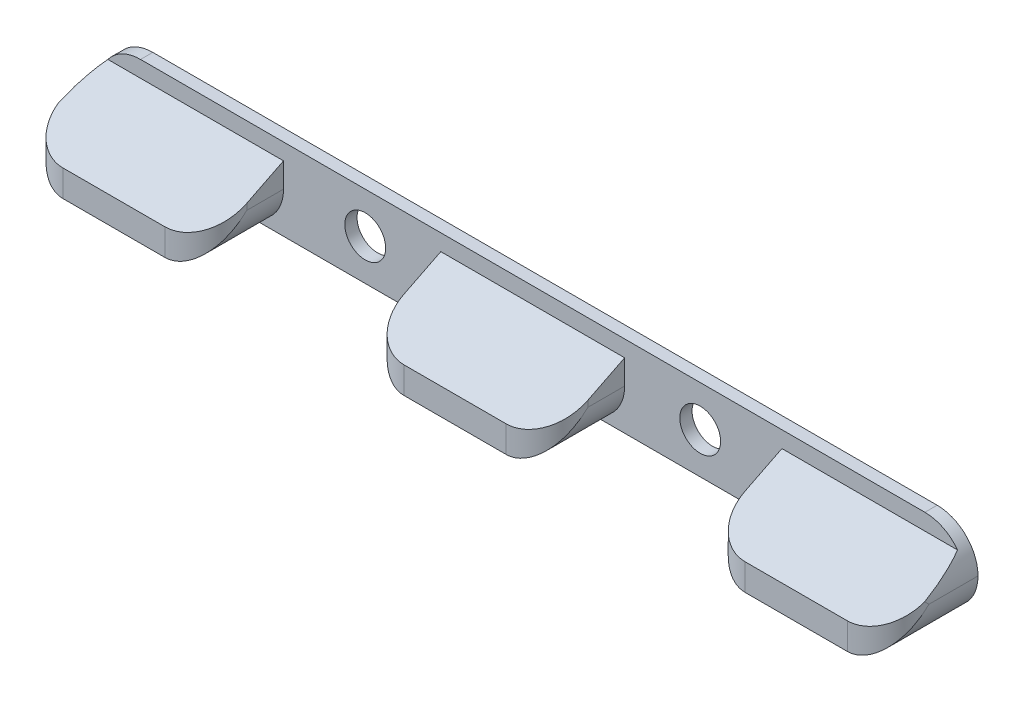
ISO-10303-21;
HEADER;
FILE_DESCRIPTION(('STEP AP214'),'2;1');
FILE_NAME('part.step','',(''),(''),'','','');
FILE_SCHEMA(('AUTOMOTIVE_DESIGN { 1 0 10303 214 1 1 1 1 }'));
ENDSEC;
DATA;
#1=APPLICATION_CONTEXT('core data for automotive mechanical design processes');
#2=APPLICATION_PROTOCOL_DEFINITION('international standard','automotive_design',2000,#1);
#3=PRODUCT_CONTEXT('',#1,'mechanical');
#4=PRODUCT('Part','Part','',(#3));
#5=PRODUCT_RELATED_PRODUCT_CATEGORY('part','',(#4));
#6=PRODUCT_DEFINITION_FORMATION('','',#4);
#7=PRODUCT_DEFINITION_CONTEXT('part definition',#1,'design');
#8=PRODUCT_DEFINITION('design','',#6,#7);
#9=PRODUCT_DEFINITION_SHAPE('','',#8);
#10=(LENGTH_UNIT() NAMED_UNIT(*) SI_UNIT(.MILLI.,.METRE.));
#11=(NAMED_UNIT(*) PLANE_ANGLE_UNIT() SI_UNIT($,.RADIAN.));
#12=(NAMED_UNIT(*) SI_UNIT($,.STERADIAN.) SOLID_ANGLE_UNIT());
#13=UNCERTAINTY_MEASURE_WITH_UNIT(LENGTH_MEASURE(1.E-05),#10,'distance_accuracy_value','');
#14=(GEOMETRIC_REPRESENTATION_CONTEXT(3) GLOBAL_UNCERTAINTY_ASSIGNED_CONTEXT((#13)) GLOBAL_UNIT_ASSIGNED_CONTEXT((#10,
#11,#12)) REPRESENTATION_CONTEXT('',''));
#15=CARTESIAN_POINT('',(0.,0.,0.));
#16=DIRECTION('',(0.,0.,1.));
#17=DIRECTION('',(1.,0.,0.));
#18=AXIS2_PLACEMENT_3D('',#15,#16,#17);
#19=CARTESIAN_POINT('',(96.,0.,3.));
#20=DIRECTION('',(0.,0.,-1.));
#21=DIRECTION('',(-1.,0.,0.));
#22=AXIS2_PLACEMENT_3D('',#19,#20,#21);
#23=PLANE('',#22);
#24=CARTESIAN_POINT('',(-96.,0.,3.));
#25=DIRECTION('',(0.,0.,1.));
#26=DIRECTION('',(-1.,0.,0.));
#27=AXIS2_PLACEMENT_3D('',#24,#25,#26);
#28=CIRCLE('',#27,10.);
#29=CARTESIAN_POINT('',(-96.,10.,3.));
#30=VERTEX_POINT('',#29);
#31=CARTESIAN_POINT('',(-104.,6.00000000000014,3.));
#32=VERTEX_POINT('',#31);
#33=EDGE_CURVE('E378',#30,#32,#28,.T.);
#34=ORIENTED_EDGE('',*,*,#33,.T.);
#35=DIRECTION('',(1.,0.,0.));
#36=VECTOR('',#35,1.);
#37=CARTESIAN_POINT('',(96.,6.00000000000014,3.));
#38=LINE('',#37,#36);
#39=CARTESIAN_POINT('',(-61.,6.00000000000014,3.));
#40=VERTEX_POINT('',#39);
#41=EDGE_CURVE('E420',#32,#40,#38,.T.);
#42=ORIENTED_EDGE('',*,*,#41,.T.);
#43=DIRECTION('',(0.,-1.,0.));
#44=VECTOR('',#43,1.);
#45=CARTESIAN_POINT('',(-61.,0.,3.));
#46=LINE('',#45,#44);
#47=CARTESIAN_POINT('',(-61.,0.,3.));
#48=VERTEX_POINT('',#47);
#49=EDGE_CURVE('E343',#40,#48,#46,.T.);
#50=ORIENTED_EDGE('',*,*,#49,.T.);
#51=CARTESIAN_POINT('',(-71.,0.,3.));
#52=DIRECTION('',(0.,0.,-1.));
#53=DIRECTION('',(-1.,0.,0.));
#54=AXIS2_PLACEMENT_3D('',#51,#52,#53);
#55=CIRCLE('',#54,10.);
#56=CARTESIAN_POINT('',(-71.,-10.,3.));
#57=VERTEX_POINT('',#56);
#58=EDGE_CURVE('E291',#48,#57,#55,.T.);
#59=ORIENTED_EDGE('',*,*,#58,.T.);
#60=DIRECTION('',(1.,0.,0.));
#61=VECTOR('',#60,1.);
#62=CARTESIAN_POINT('',(-106.,-10.,3.));
#63=LINE('',#62,#61);
#64=CARTESIAN_POINT('',(-12.5,-10.,3.));
#65=VERTEX_POINT('',#64);
#66=EDGE_CURVE('E305',#57,#65,#63,.T.);
#67=ORIENTED_EDGE('',*,*,#66,.T.);
#68=CARTESIAN_POINT('',(-12.5,0.,3.));
#69=DIRECTION('',(0.,0.,-1.));
#70=DIRECTION('',(-1.,0.,0.));
#71=AXIS2_PLACEMENT_3D('',#68,#69,#70);
#72=CIRCLE('',#71,10.);
#73=CARTESIAN_POINT('',(-22.5,0.,3.));
#74=VERTEX_POINT('',#73);
#75=EDGE_CURVE('E54',#65,#74,#72,.T.);
#76=ORIENTED_EDGE('',*,*,#75,.T.);
#77=DIRECTION('',(0.,1.,0.));
#78=VECTOR('',#77,1.);
#79=CARTESIAN_POINT('',(-22.5,0.,3.));
#80=LINE('',#79,#78);
#81=CARTESIAN_POINT('',(-22.5,6.00000000000014,3.));
#82=VERTEX_POINT('',#81);
#83=EDGE_CURVE('E303',#74,#82,#80,.T.);
#84=ORIENTED_EDGE('',*,*,#83,.T.);
#85=DIRECTION('',(1.,0.,0.));
#86=VECTOR('',#85,1.);
#87=CARTESIAN_POINT('',(96.,6.00000000000014,3.));
#88=LINE('',#87,#86);
#89=CARTESIAN_POINT('',(22.5,6.00000000000014,3.));
#90=VERTEX_POINT('',#89);
#91=EDGE_CURVE('E413',#82,#90,#88,.T.);
#92=ORIENTED_EDGE('',*,*,#91,.T.);
#93=DIRECTION('',(0.,-1.,0.));
#94=VECTOR('',#93,1.);
#95=CARTESIAN_POINT('',(22.5,0.,3.));
#96=LINE('',#95,#94);
#97=CARTESIAN_POINT('',(22.5,0.,3.));
#98=VERTEX_POINT('',#97);
#99=EDGE_CURVE('E234',#90,#98,#96,.T.);
#100=ORIENTED_EDGE('',*,*,#99,.T.);
#101=CARTESIAN_POINT('',(12.5,0.,3.));
#102=DIRECTION('',(0.,0.,-1.));
#103=DIRECTION('',(-1.,0.,0.));
#104=AXIS2_PLACEMENT_3D('',#101,#102,#103);
#105=CIRCLE('',#104,10.);
#106=CARTESIAN_POINT('',(12.5,-10.,3.));
#107=VERTEX_POINT('',#106);
#108=EDGE_CURVE('E11',#98,#107,#105,.T.);
#109=ORIENTED_EDGE('',*,*,#108,.T.);
#110=CARTESIAN_POINT('',(71.,-10.,3.));
#111=VERTEX_POINT('',#110);
#112=EDGE_CURVE('E381',#107,#111,#63,.T.);
#113=ORIENTED_EDGE('',*,*,#112,.T.);
#114=CARTESIAN_POINT('',(71.,0.,3.));
#115=DIRECTION('',(0.,0.,-1.));
#116=DIRECTION('',(-1.,0.,0.));
#117=AXIS2_PLACEMENT_3D('',#114,#115,#116);
#118=CIRCLE('',#117,10.);
#119=CARTESIAN_POINT('',(61.,0.,3.));
#120=VERTEX_POINT('',#119);
#121=EDGE_CURVE('E295',#111,#120,#118,.T.);
#122=ORIENTED_EDGE('',*,*,#121,.T.);
#123=DIRECTION('',(0.,1.,0.));
#124=VECTOR('',#123,1.);
#125=CARTESIAN_POINT('',(61.,0.,3.));
#126=LINE('',#125,#124);
#127=CARTESIAN_POINT('',(61.,6.00000000000014,3.));
#128=VERTEX_POINT('',#127);
#129=EDGE_CURVE('E332',#120,#128,#126,.T.);
#130=ORIENTED_EDGE('',*,*,#129,.T.);
#131=DIRECTION('',(1.,0.,0.));
#132=VECTOR('',#131,1.);
#133=CARTESIAN_POINT('',(106.,6.00000000000014,3.));
#134=LINE('',#133,#132);
#135=CARTESIAN_POINT('',(104.,6.00000000000014,3.));
#136=VERTEX_POINT('',#135);
#137=EDGE_CURVE('E416',#128,#136,#134,.T.);
#138=ORIENTED_EDGE('',*,*,#137,.T.);
#139=CARTESIAN_POINT('',(96.,0.,3.));
#140=DIRECTION('',(0.,0.,1.));
#141=DIRECTION('',(-1.,0.,0.));
#142=AXIS2_PLACEMENT_3D('',#139,#140,#141);
#143=CIRCLE('',#142,10.);
#144=CARTESIAN_POINT('',(96.,10.,3.));
#145=VERTEX_POINT('',#144);
#146=EDGE_CURVE('E371',#136,#145,#143,.T.);
#147=ORIENTED_EDGE('',*,*,#146,.T.);
#148=DIRECTION('',(-1.,0.,0.));
#149=VECTOR('',#148,1.);
#150=CARTESIAN_POINT('',(-96.,10.,3.));
#151=LINE('',#150,#149);
#152=EDGE_CURVE('E374',#145,#30,#151,.T.);
#153=ORIENTED_EDGE('',*,*,#152,.T.);
#154=EDGE_LOOP('',(#34,#42,#50,#59,#67,#76,#84,#92,#100,#109,#113,#122,#130,#138,#147,#153));
#155=FACE_BOUND('',#154,.T.);
#156=CARTESIAN_POINT('',(-41.,0.,3.));
#157=DIRECTION('',(0.,0.,1.));
#158=DIRECTION('',(1.,0.,0.));
#159=AXIS2_PLACEMENT_3D('',#156,#157,#158);
#160=CIRCLE('',#159,5.);
#161=CARTESIAN_POINT('',(-36.,0.,3.));
#162=VERTEX_POINT('',#161);
#163=EDGE_CURVE('E363',#162,#162,#160,.T.);
#164=ORIENTED_EDGE('',*,*,#163,.F.);
#165=EDGE_LOOP('',(#164));
#166=FACE_BOUND('',#165,.T.);
#167=CARTESIAN_POINT('',(41.,0.,3.));
#168=DIRECTION('',(0.,0.,1.));
#169=DIRECTION('',(1.,0.,0.));
#170=AXIS2_PLACEMENT_3D('',#167,#168,#169);
#171=CIRCLE('',#170,5.);
#172=CARTESIAN_POINT('',(46.,0.,3.));
#173=VERTEX_POINT('',#172);
#174=EDGE_CURVE('E355',#173,#173,#171,.T.);
#175=ORIENTED_EDGE('',*,*,#174,.F.);
#176=EDGE_LOOP('',(#175));
#177=FACE_BOUND('',#176,.T.);
#178=ADVANCED_FACE('F45',(#155,#166,#177),#23,.F.);
#179=CARTESIAN_POINT('',(96.,0.,0.));
#180=DIRECTION('',(0.,0.,-1.));
#181=DIRECTION('',(-1.,0.,0.));
#182=AXIS2_PLACEMENT_3D('',#179,#180,#181);
#183=PLANE('',#182);
#184=DIRECTION('',(1.,0.,0.));
#185=VECTOR('',#184,1.);
#186=CARTESIAN_POINT('',(-106.,-10.,0.));
#187=LINE('',#186,#185);
#188=CARTESIAN_POINT('',(-96.,-10.,0.));
#189=VERTEX_POINT('',#188);
#190=CARTESIAN_POINT('',(96.,-10.,0.));
#191=VERTEX_POINT('',#190);
#192=EDGE_CURVE('E375',#189,#191,#187,.T.);
#193=ORIENTED_EDGE('',*,*,#192,.F.);
#194=CARTESIAN_POINT('',(-96.,0.,0.));
#195=DIRECTION('',(0.,0.,-1.));
#196=DIRECTION('',(-1.,0.,0.));
#197=AXIS2_PLACEMENT_3D('',#194,#195,#196);
#198=CIRCLE('',#197,10.);
#199=CARTESIAN_POINT('',(-106.,0.,0.));
#200=VERTEX_POINT('',#199);
#201=EDGE_CURVE('E264',#189,#200,#198,.T.);
#202=ORIENTED_EDGE('',*,*,#201,.T.);
#203=CARTESIAN_POINT('',(-96.,0.,0.));
#204=DIRECTION('',(0.,0.,1.));
#205=DIRECTION('',(-1.,0.,0.));
#206=AXIS2_PLACEMENT_3D('',#203,#204,#205);
#207=CIRCLE('',#206,10.);
#208=CARTESIAN_POINT('',(-96.,10.,0.));
#209=VERTEX_POINT('',#208);
#210=EDGE_CURVE('E391',#209,#200,#207,.T.);
#211=ORIENTED_EDGE('',*,*,#210,.F.);
#212=DIRECTION('',(-1.,0.,0.));
#213=VECTOR('',#212,1.);
#214=CARTESIAN_POINT('',(-96.,10.,0.));
#215=LINE('',#214,#213);
#216=CARTESIAN_POINT('',(96.,10.,0.));
#217=VERTEX_POINT('',#216);
#218=EDGE_CURVE('E388',#217,#209,#215,.T.);
#219=ORIENTED_EDGE('',*,*,#218,.F.);
#220=CARTESIAN_POINT('',(96.,0.,0.));
#221=DIRECTION('',(0.,0.,1.));
#222=DIRECTION('',(-1.,0.,0.));
#223=AXIS2_PLACEMENT_3D('',#220,#221,#222);
#224=CIRCLE('',#223,10.);
#225=CARTESIAN_POINT('',(106.,0.,0.));
#226=VERTEX_POINT('',#225);
#227=EDGE_CURVE('E367',#226,#217,#224,.T.);
#228=ORIENTED_EDGE('',*,*,#227,.F.);
#229=CARTESIAN_POINT('',(96.,0.,0.));
#230=DIRECTION('',(0.,0.,-1.));
#231=DIRECTION('',(-1.,0.,0.));
#232=AXIS2_PLACEMENT_3D('',#229,#230,#231);
#233=CIRCLE('',#232,10.);
#234=EDGE_CURVE('E261',#226,#191,#233,.T.);
#235=ORIENTED_EDGE('',*,*,#234,.T.);
#236=EDGE_LOOP('',(#193,#202,#211,#219,#228,#235));
#237=FACE_BOUND('',#236,.T.);
#238=CARTESIAN_POINT('',(-41.,0.,0.));
#239=DIRECTION('',(0.,0.,1.));
#240=DIRECTION('',(1.,0.,0.));
#241=AXIS2_PLACEMENT_3D('',#238,#239,#240);
#242=CIRCLE('',#241,5.);
#243=CARTESIAN_POINT('',(-36.,0.,0.));
#244=VERTEX_POINT('',#243);
#245=EDGE_CURVE('E359',#244,#244,#242,.T.);
#246=ORIENTED_EDGE('',*,*,#245,.T.);
#247=EDGE_LOOP('',(#246));
#248=FACE_BOUND('',#247,.T.);
#249=CARTESIAN_POINT('',(41.,0.,0.));
#250=DIRECTION('',(0.,0.,1.));
#251=DIRECTION('',(1.,0.,0.));
#252=AXIS2_PLACEMENT_3D('',#249,#250,#251);
#253=CIRCLE('',#252,5.);
#254=CARTESIAN_POINT('',(46.,0.,0.));
#255=VERTEX_POINT('',#254);
#256=EDGE_CURVE('E354',#255,#255,#253,.T.);
#257=ORIENTED_EDGE('',*,*,#256,.T.);
#258=EDGE_LOOP('',(#257));
#259=FACE_BOUND('',#258,.T.);
#260=ADVANCED_FACE('F506',(#237,#248,#259),#183,.T.);
#261=CARTESIAN_POINT('',(96.,0.,3.));
#262=DIRECTION('',(0.,0.,-1.));
#263=DIRECTION('',(-1.,0.,0.));
#264=AXIS2_PLACEMENT_3D('',#261,#262,#263);
#265=CYLINDRICAL_SURFACE('',#264,10.);
#266=ORIENTED_EDGE('',*,*,#227,.T.);
#267=DIRECTION('',(0.,0.,-1.));
#268=VECTOR('',#267,1.);
#269=CARTESIAN_POINT('',(96.,10.,3.));
#270=LINE('',#269,#268);
#271=EDGE_CURVE('E409',#145,#217,#270,.T.);
#272=ORIENTED_EDGE('',*,*,#271,.F.);
#273=ORIENTED_EDGE('',*,*,#146,.F.);
#274=CARTESIAN_POINT('',(96.,0.,15.0000000000002));
#275=DIRECTION('',(0.,0.894427190999914,0.447213595499962));
#276=DIRECTION('',(0.,0.447213595499962,-0.894427190999914));
#277=AXIS2_PLACEMENT_3D('',#274,#275,#276);
#278=ELLIPSE('',#277,22.3606797749977,10.);
#279=CARTESIAN_POINT('',(105.949874371066,1.00000000000002,13.0000000000001));
#280=VERTEX_POINT('',#279);
#281=EDGE_CURVE('E454',#136,#280,#278,.F.);
#282=ORIENTED_EDGE('',*,*,#281,.T.);
#283=CARTESIAN_POINT('',(96.,0.,12.));
#284=DIRECTION('',(0.,0.707106781186547,-0.707106781186547));
#285=DIRECTION('',(0.,-0.707106781186547,-0.707106781186547));
#286=AXIS2_PLACEMENT_3D('',#283,#284,#285);
#287=ELLIPSE('',#286,14.1421356237309,10.);
#288=CARTESIAN_POINT('',(106.,0.,11.9999999999999));
#289=VERTEX_POINT('',#288);
#290=EDGE_CURVE('E247',#289,#280,#287,.F.);
#291=ORIENTED_EDGE('',*,*,#290,.F.);
#292=DIRECTION('',(0.,0.,-1.));
#293=VECTOR('',#292,1.);
#294=CARTESIAN_POINT('',(106.,0.,3.));
#295=LINE('',#294,#293);
#296=EDGE_CURVE('E384',#289,#226,#295,.T.);
#297=ORIENTED_EDGE('',*,*,#296,.T.);
#298=EDGE_LOOP('',(#266,#272,#273,#282,#291,#297));
#299=FACE_BOUND('',#298,.T.);
#300=ADVANCED_FACE('F502',(#299),#265,.T.);
#301=CARTESIAN_POINT('',(-96.,10.,3.));
#302=DIRECTION('',(0.,-1.,0.));
#303=DIRECTION('',(0.,0.,-1.));
#304=AXIS2_PLACEMENT_3D('',#301,#302,#303);
#305=PLANE('',#304);
#306=ORIENTED_EDGE('',*,*,#218,.T.);
#307=DIRECTION('',(0.,0.,-1.));
#308=VECTOR('',#307,1.);
#309=CARTESIAN_POINT('',(-96.,10.,3.));
#310=LINE('',#309,#308);
#311=EDGE_CURVE('E405',#30,#209,#310,.T.);
#312=ORIENTED_EDGE('',*,*,#311,.F.);
#313=ORIENTED_EDGE('',*,*,#152,.F.);
#314=ORIENTED_EDGE('',*,*,#271,.T.);
#315=EDGE_LOOP('',(#306,#312,#313,#314));
#316=FACE_BOUND('',#315,.T.);
#317=ADVANCED_FACE('F512',(#316),#305,.F.);
#318=CARTESIAN_POINT('',(-96.,0.,3.));
#319=DIRECTION('',(0.,0.,-1.));
#320=DIRECTION('',(-1.,0.,0.));
#321=AXIS2_PLACEMENT_3D('',#318,#319,#320);
#322=CYLINDRICAL_SURFACE('',#321,10.);
#323=ORIENTED_EDGE('',*,*,#210,.T.);
#324=DIRECTION('',(0.,0.,-1.));
#325=VECTOR('',#324,1.);
#326=CARTESIAN_POINT('',(-106.,0.,3.));
#327=LINE('',#326,#325);
#328=CARTESIAN_POINT('',(-106.,0.,11.9999999999999));
#329=VERTEX_POINT('',#328);
#330=EDGE_CURVE('E401',#329,#200,#327,.T.);
#331=ORIENTED_EDGE('',*,*,#330,.F.);
#332=CARTESIAN_POINT('',(-96.,0.,12.));
#333=DIRECTION('',(0.,-0.707106781186547,0.707106781186547));
#334=DIRECTION('',(0.,-0.707106781186547,-0.707106781186547));
#335=AXIS2_PLACEMENT_3D('',#332,#333,#334);
#336=ELLIPSE('',#335,14.1421356237309,10.);
#337=CARTESIAN_POINT('',(-105.949874371066,1.00000000000006,13.0000000000001));
#338=VERTEX_POINT('',#337);
#339=EDGE_CURVE('E476',#329,#338,#336,.F.);
#340=ORIENTED_EDGE('',*,*,#339,.T.);
#341=CARTESIAN_POINT('',(-96.,0.,15.0000000000002));
#342=DIRECTION('',(0.,-0.894427190999914,-0.447213595499962));
#343=DIRECTION('',(0.,0.447213595499962,-0.894427190999914));
#344=AXIS2_PLACEMENT_3D('',#341,#342,#343);
#345=ELLIPSE('',#344,22.3606797749977,10.);
#346=EDGE_CURVE('E439',#338,#32,#345,.T.);
#347=ORIENTED_EDGE('',*,*,#346,.T.);
#348=ORIENTED_EDGE('',*,*,#33,.F.);
#349=ORIENTED_EDGE('',*,*,#311,.T.);
#350=EDGE_LOOP('',(#323,#331,#340,#347,#348,#349));
#351=FACE_BOUND('',#350,.T.);
#352=ADVANCED_FACE('F543',(#351),#322,.T.);
#353=CARTESIAN_POINT('',(-106.,-10.,3.));
#354=DIRECTION('',(0.,1.,0.));
#355=DIRECTION('',(0.,0.,1.));
#356=AXIS2_PLACEMENT_3D('',#353,#354,#355);
#357=PLANE('',#356);
#358=DIRECTION('',(-1.,0.,0.));
#359=VECTOR('',#358,1.);
#360=CARTESIAN_POINT('',(-95.9999999999999,-10.,22.));
#361=LINE('',#360,#359);
#362=CARTESIAN_POINT('',(-71.0000000000001,-10.,22.));
#363=VERTEX_POINT('',#362);
#364=CARTESIAN_POINT('',(-95.9999999999999,-10.,22.));
#365=VERTEX_POINT('',#364);
#366=EDGE_CURVE('E335',#363,#365,#361,.T.);
#367=ORIENTED_EDGE('',*,*,#366,.T.);
#368=DIRECTION('',(0.,0.,-1.));
#369=VECTOR('',#368,1.);
#370=CARTESIAN_POINT('',(-96.,-10.,3.));
#371=LINE('',#370,#369);
#372=EDGE_CURVE('E257',#365,#189,#371,.T.);
#373=ORIENTED_EDGE('',*,*,#372,.T.);
#374=ORIENTED_EDGE('',*,*,#192,.T.);
#375=DIRECTION('',(0.,0.,-1.));
#376=VECTOR('',#375,1.);
#377=CARTESIAN_POINT('',(96.,-10.,3.));
#378=LINE('',#377,#376);
#379=CARTESIAN_POINT('',(96.,-10.,22.));
#380=VERTEX_POINT('',#379);
#381=EDGE_CURVE('E245',#191,#380,#378,.F.);
#382=ORIENTED_EDGE('',*,*,#381,.T.);
#383=DIRECTION('',(-1.,0.,0.));
#384=VECTOR('',#383,1.);
#385=CARTESIAN_POINT('',(96.,-10.,22.));
#386=LINE('',#385,#384);
#387=CARTESIAN_POINT('',(71.0000000000001,-10.,22.));
#388=VERTEX_POINT('',#387);
#389=EDGE_CURVE('E325',#380,#388,#386,.T.);
#390=ORIENTED_EDGE('',*,*,#389,.T.);
#391=DIRECTION('',(0.,0.,-1.));
#392=VECTOR('',#391,1.);
#393=CARTESIAN_POINT('',(71.,-10.,3.));
#394=LINE('',#393,#392);
#395=EDGE_CURVE('E240',#388,#111,#394,.T.);
#396=ORIENTED_EDGE('',*,*,#395,.T.);
#397=ORIENTED_EDGE('',*,*,#112,.F.);
#398=DIRECTION('',(0.,0.,1.));
#399=VECTOR('',#398,1.);
#400=CARTESIAN_POINT('',(12.5,-10.,11.9999999999999));
#401=LINE('',#400,#399);
#402=CARTESIAN_POINT('',(12.4999999999999,-10.,22.));
#403=VERTEX_POINT('',#402);
#404=EDGE_CURVE('E232',#107,#403,#401,.T.);
#405=ORIENTED_EDGE('',*,*,#404,.T.);
#406=DIRECTION('',(-1.,0.,0.));
#407=VECTOR('',#406,1.);
#408=CARTESIAN_POINT('',(-12.4999999999999,-10.,22.));
#409=LINE('',#408,#407);
#410=CARTESIAN_POINT('',(-12.4999999999999,-10.,22.));
#411=VERTEX_POINT('',#410);
#412=EDGE_CURVE('E218',#403,#411,#409,.T.);
#413=ORIENTED_EDGE('',*,*,#412,.T.);
#414=DIRECTION('',(0.,0.,-1.));
#415=VECTOR('',#414,1.);
#416=CARTESIAN_POINT('',(-12.5,-10.,3.));
#417=LINE('',#416,#415);
#418=EDGE_CURVE('E230',#411,#65,#417,.T.);
#419=ORIENTED_EDGE('',*,*,#418,.T.);
#420=ORIENTED_EDGE('',*,*,#66,.F.);
#421=DIRECTION('',(0.,0.,1.));
#422=VECTOR('',#421,1.);
#423=CARTESIAN_POINT('',(-71.,-10.,11.9999999999999));
#424=LINE('',#423,#422);
#425=EDGE_CURVE('E253',#57,#363,#424,.T.);
#426=ORIENTED_EDGE('',*,*,#425,.T.);
#427=EDGE_LOOP('',(#367,#373,#374,#382,#390,#396,#397,#405,#413,#419,#420,#426));
#428=FACE_BOUND('',#427,.T.);
#429=ADVANCED_FACE('F229',(#428),#357,.F.);
#430=CARTESIAN_POINT('',(-41.,0.,3.));
#431=DIRECTION('',(0.,0.,-1.));
#432=DIRECTION('',(-1.,0.,0.));
#433=AXIS2_PLACEMENT_3D('',#430,#431,#432);
#434=CYLINDRICAL_SURFACE('',#433,5.);
#435=ORIENTED_EDGE('',*,*,#163,.T.);
#436=EDGE_LOOP('',(#435));
#437=FACE_BOUND('',#436,.T.);
#438=ORIENTED_EDGE('',*,*,#245,.F.);
#439=EDGE_LOOP('',(#438));
#440=FACE_BOUND('',#439,.T.);
#441=ADVANCED_FACE('F538',(#437,#440),#434,.F.);
#442=CARTESIAN_POINT('',(41.,0.,3.));
#443=DIRECTION('',(0.,0.,-1.));
#444=DIRECTION('',(-1.,0.,0.));
#445=AXIS2_PLACEMENT_3D('',#442,#443,#444);
#446=CYLINDRICAL_SURFACE('',#445,5.);
#447=ORIENTED_EDGE('',*,*,#174,.T.);
#448=EDGE_LOOP('',(#447));
#449=FACE_BOUND('',#448,.T.);
#450=ORIENTED_EDGE('',*,*,#256,.F.);
#451=EDGE_LOOP('',(#450));
#452=FACE_BOUND('',#451,.T.);
#453=ADVANCED_FACE('F750',(#449,#452),#446,.F.);
#454=CARTESIAN_POINT('',(-61.,-4.,0.));
#455=DIRECTION('',(1.,0.,0.));
#456=DIRECTION('',(0.,0.,-1.));
#457=AXIS2_PLACEMENT_3D('',#454,#455,#456);
#458=PLANE('',#457);
#459=DIRECTION('',(0.,-1.,0.));
#460=VECTOR('',#459,1.);
#461=CARTESIAN_POINT('',(-61.,-4.,11.9999999999999));
#462=LINE('',#461,#460);
#463=CARTESIAN_POINT('',(-61.,1.50000000000013,11.9999999999999));
#464=VERTEX_POINT('',#463);
#465=CARTESIAN_POINT('',(-61.,0.,11.9999999999999));
#466=VERTEX_POINT('',#465);
#467=EDGE_CURVE('E338',#464,#466,#462,.T.);
#468=ORIENTED_EDGE('',*,*,#467,.T.);
#469=DIRECTION('',(0.,0.,1.));
#470=VECTOR('',#469,1.);
#471=CARTESIAN_POINT('',(-61.,0.,3.));
#472=LINE('',#471,#470);
#473=EDGE_CURVE('E273',#466,#48,#472,.F.);
#474=ORIENTED_EDGE('',*,*,#473,.T.);
#475=ORIENTED_EDGE('',*,*,#49,.F.);
#476=DIRECTION('',(0.,-0.447213595499962,0.894427190999914));
#477=VECTOR('',#476,1.);
#478=CARTESIAN_POINT('',(-61.,6.00000000000014,3.));
#479=LINE('',#478,#477);
#480=EDGE_CURVE('E424',#40,#464,#479,.T.);
#481=ORIENTED_EDGE('',*,*,#480,.T.);
#482=EDGE_LOOP('',(#468,#474,#475,#481));
#483=FACE_BOUND('',#482,.T.);
#484=ADVANCED_FACE('F740',(#483),#458,.T.);
#485=CARTESIAN_POINT('',(-96.,-4.,12.));
#486=DIRECTION('',(0.,-1.,0.));
#487=DIRECTION('',(0.,0.,-1.));
#488=AXIS2_PLACEMENT_3D('',#485,#486,#487);
#489=CYLINDRICAL_SURFACE('',#488,10.);
#490=ORIENTED_EDGE('',*,*,#339,.F.);
#491=CARTESIAN_POINT('',(-96.,0.,12.));
#492=DIRECTION('',(0.,-0.707106781186547,-0.707106781186547));
#493=DIRECTION('',(0.,-0.707106781186547,0.707106781186547));
#494=AXIS2_PLACEMENT_3D('',#491,#492,#493);
#495=ELLIPSE('',#494,14.1421356237309,10.);
#496=EDGE_CURVE('E267',#329,#365,#495,.F.);
#497=ORIENTED_EDGE('',*,*,#496,.T.);
#498=DIRECTION('',(0.,-1.,0.));
#499=VECTOR('',#498,1.);
#500=CARTESIAN_POINT('',(-95.9999999999999,-4.,22.));
#501=LINE('',#500,#499);
#502=CARTESIAN_POINT('',(-95.9999999999999,-3.49999999999996,22.));
#503=VERTEX_POINT('',#502);
#504=EDGE_CURVE('E339',#503,#365,#501,.T.);
#505=ORIENTED_EDGE('',*,*,#504,.F.);
#506=CARTESIAN_POINT('',(-96.,1.50000000000009,12.));
#507=DIRECTION('',(0.,-0.894427190999914,-0.447213595499962));
#508=DIRECTION('',(0.,-0.447213595499962,0.894427190999914));
#509=AXIS2_PLACEMENT_3D('',#506,#507,#508);
#510=ELLIPSE('',#509,11.180339887499,10.);
#511=EDGE_CURVE('E436',#503,#338,#510,.T.);
#512=ORIENTED_EDGE('',*,*,#511,.T.);
#513=EDGE_LOOP('',(#490,#497,#505,#512));
#514=FACE_BOUND('',#513,.T.);
#515=ADVANCED_FACE('F730',(#514),#489,.T.);
#516=CARTESIAN_POINT('',(-95.9999999999999,-4.,22.));
#517=DIRECTION('',(0.,0.,1.));
#518=DIRECTION('',(1.,0.,0.));
#519=AXIS2_PLACEMENT_3D('',#516,#517,#518);
#520=PLANE('',#519);
#521=ORIENTED_EDGE('',*,*,#366,.F.);
#522=DIRECTION('',(0.,-1.,0.));
#523=VECTOR('',#522,1.);
#524=CARTESIAN_POINT('',(-71.0000000000001,-4.,22.));
#525=LINE('',#524,#523);
#526=CARTESIAN_POINT('',(-71.0000000000001,-3.49999999999996,22.));
#527=VERTEX_POINT('',#526);
#528=EDGE_CURVE('E344',#527,#363,#525,.T.);
#529=ORIENTED_EDGE('',*,*,#528,.F.);
#530=DIRECTION('',(-1.,0.,0.));
#531=VECTOR('',#530,1.);
#532=CARTESIAN_POINT('',(96.,-3.49999999999996,22.));
#533=LINE('',#532,#531);
#534=EDGE_CURVE('E432',#527,#503,#533,.T.);
#535=ORIENTED_EDGE('',*,*,#534,.T.);
#536=ORIENTED_EDGE('',*,*,#504,.T.);
#537=EDGE_LOOP('',(#521,#529,#535,#536));
#538=FACE_BOUND('',#537,.T.);
#539=ADVANCED_FACE('F720',(#538),#520,.T.);
#540=CARTESIAN_POINT('',(-71.,-4.,12.));
#541=DIRECTION('',(0.,-1.,0.));
#542=DIRECTION('',(0.,0.,-1.));
#543=AXIS2_PLACEMENT_3D('',#540,#541,#542);
#544=CYLINDRICAL_SURFACE('',#543,10.);
#545=ORIENTED_EDGE('',*,*,#528,.T.);
#546=CARTESIAN_POINT('',(-71.,0.,12.));
#547=DIRECTION('',(0.,-0.707106781186547,-0.707106781186547));
#548=DIRECTION('',(0.,-0.707106781186547,0.707106781186547));
#549=AXIS2_PLACEMENT_3D('',#546,#547,#548);
#550=ELLIPSE('',#549,14.1421356237309,10.);
#551=EDGE_CURVE('E270',#363,#466,#550,.F.);
#552=ORIENTED_EDGE('',*,*,#551,.T.);
#553=ORIENTED_EDGE('',*,*,#467,.F.);
#554=CARTESIAN_POINT('',(-71.,1.50000000000009,12.));
#555=DIRECTION('',(0.,-0.894427190999914,-0.447213595499962));
#556=DIRECTION('',(0.,-0.447213595499962,0.894427190999914));
#557=AXIS2_PLACEMENT_3D('',#554,#555,#556);
#558=ELLIPSE('',#557,11.180339887499,10.);
#559=EDGE_CURVE('E428',#464,#527,#558,.T.);
#560=ORIENTED_EDGE('',*,*,#559,.T.);
#561=EDGE_LOOP('',(#545,#552,#553,#560));
#562=FACE_BOUND('',#561,.T.);
#563=ADVANCED_FACE('F711',(#562),#544,.T.);
#564=CARTESIAN_POINT('',(61.,-4.,0.));
#565=DIRECTION('',(-1.,0.,0.));
#566=DIRECTION('',(0.,0.,1.));
#567=AXIS2_PLACEMENT_3D('',#564,#565,#566);
#568=PLANE('',#567);
#569=ORIENTED_EDGE('',*,*,#129,.F.);
#570=DIRECTION('',(0.,0.,-1.));
#571=VECTOR('',#570,1.);
#572=CARTESIAN_POINT('',(61.,0.,11.9999999999999));
#573=LINE('',#572,#571);
#574=CARTESIAN_POINT('',(61.,0.,11.9999999999999));
#575=VERTEX_POINT('',#574);
#576=EDGE_CURVE('E279',#120,#575,#573,.F.);
#577=ORIENTED_EDGE('',*,*,#576,.T.);
#578=DIRECTION('',(0.,-1.,0.));
#579=VECTOR('',#578,1.);
#580=CARTESIAN_POINT('',(61.,-4.,11.9999999999999));
#581=LINE('',#580,#579);
#582=CARTESIAN_POINT('',(61.,1.50000000000013,11.9999999999999));
#583=VERTEX_POINT('',#582);
#584=EDGE_CURVE('E312',#583,#575,#581,.T.);
#585=ORIENTED_EDGE('',*,*,#584,.F.);
#586=DIRECTION('',(0.,-0.447213595499962,0.894427190999914));
#587=VECTOR('',#586,1.);
#588=CARTESIAN_POINT('',(61.,-4.,23.0000000000001));
#589=LINE('',#588,#587);
#590=EDGE_CURVE('E450',#583,#128,#589,.F.);
#591=ORIENTED_EDGE('',*,*,#590,.T.);
#592=EDGE_LOOP('',(#569,#577,#585,#591));
#593=FACE_BOUND('',#592,.T.);
#594=ADVANCED_FACE('F516',(#593),#568,.T.);
#595=CARTESIAN_POINT('',(71.,-4.,12.));
#596=DIRECTION('',(0.,-1.,0.));
#597=DIRECTION('',(0.,0.,-1.));
#598=AXIS2_PLACEMENT_3D('',#595,#596,#597);
#599=CYLINDRICAL_SURFACE('',#598,10.);
#600=ORIENTED_EDGE('',*,*,#584,.T.);
#601=CARTESIAN_POINT('',(71.,0.,12.));
#602=DIRECTION('',(0.,-0.707106781186547,-0.707106781186547));
#603=DIRECTION('',(0.,-0.707106781186547,0.707106781186547));
#604=AXIS2_PLACEMENT_3D('',#601,#602,#603);
#605=ELLIPSE('',#604,14.1421356237309,10.);
#606=EDGE_CURVE('E282',#575,#388,#605,.F.);
#607=ORIENTED_EDGE('',*,*,#606,.T.);
#608=DIRECTION('',(0.,-1.,0.));
#609=VECTOR('',#608,1.);
#610=CARTESIAN_POINT('',(71.0000000000001,-4.,22.));
#611=LINE('',#610,#609);
#612=CARTESIAN_POINT('',(71.0000000000001,-3.49999999999996,22.));
#613=VERTEX_POINT('',#612);
#614=EDGE_CURVE('E317',#613,#388,#611,.T.);
#615=ORIENTED_EDGE('',*,*,#614,.F.);
#616=CARTESIAN_POINT('',(71.,1.5000000000001,12.));
#617=DIRECTION('',(0.,0.894427190999914,0.447213595499962));
#618=DIRECTION('',(0.,-0.447213595499962,0.894427190999914));
#619=AXIS2_PLACEMENT_3D('',#616,#617,#618);
#620=ELLIPSE('',#619,11.180339887499,10.);
#621=EDGE_CURVE('E446',#613,#583,#620,.F.);
#622=ORIENTED_EDGE('',*,*,#621,.T.);
#623=EDGE_LOOP('',(#600,#607,#615,#622));
#624=FACE_BOUND('',#623,.T.);
#625=ADVANCED_FACE('F520',(#624),#599,.T.);
#626=CARTESIAN_POINT('',(96.,-4.,22.));
#627=DIRECTION('',(0.,0.,1.));
#628=DIRECTION('',(1.,0.,0.));
#629=AXIS2_PLACEMENT_3D('',#626,#627,#628);
#630=PLANE('',#629);
#631=ORIENTED_EDGE('',*,*,#389,.F.);
#632=DIRECTION('',(0.,-1.,0.));
#633=VECTOR('',#632,1.);
#634=CARTESIAN_POINT('',(96.,-4.,22.));
#635=LINE('',#634,#633);
#636=CARTESIAN_POINT('',(96.,-3.49999999999996,22.));
#637=VERTEX_POINT('',#636);
#638=EDGE_CURVE('E321',#637,#380,#635,.T.);
#639=ORIENTED_EDGE('',*,*,#638,.F.);
#640=DIRECTION('',(1.,0.,0.));
#641=VECTOR('',#640,1.);
#642=CARTESIAN_POINT('',(96.,-3.49999999999996,22.));
#643=LINE('',#642,#641);
#644=EDGE_CURVE('E442',#637,#613,#643,.F.);
#645=ORIENTED_EDGE('',*,*,#644,.T.);
#646=ORIENTED_EDGE('',*,*,#614,.T.);
#647=EDGE_LOOP('',(#631,#639,#645,#646));
#648=FACE_BOUND('',#647,.T.);
#649=ADVANCED_FACE('F496',(#648),#630,.T.);
#650=CARTESIAN_POINT('',(96.,-4.,12.));
#651=DIRECTION('',(0.,-1.,0.));
#652=DIRECTION('',(0.,0.,-1.));
#653=AXIS2_PLACEMENT_3D('',#650,#651,#652);
#654=CYLINDRICAL_SURFACE('',#653,10.);
#655=ORIENTED_EDGE('',*,*,#638,.T.);
#656=CARTESIAN_POINT('',(96.,0.,12.));
#657=DIRECTION('',(0.,-0.707106781186547,-0.707106781186547));
#658=DIRECTION('',(0.,-0.707106781186547,0.707106781186547));
#659=AXIS2_PLACEMENT_3D('',#656,#657,#658);
#660=ELLIPSE('',#659,14.1421356237309,10.);
#661=EDGE_CURVE('E276',#380,#289,#660,.F.);
#662=ORIENTED_EDGE('',*,*,#661,.T.);
#663=ORIENTED_EDGE('',*,*,#290,.T.);
#664=CARTESIAN_POINT('',(96.,1.50000000000009,12.));
#665=DIRECTION('',(0.,0.894427190999914,0.447213595499962));
#666=DIRECTION('',(0.,-0.447213595499962,0.894427190999914));
#667=AXIS2_PLACEMENT_3D('',#664,#665,#666);
#668=ELLIPSE('',#667,11.180339887499,10.);
#669=EDGE_CURVE('E457',#280,#637,#668,.F.);
#670=ORIENTED_EDGE('',*,*,#669,.T.);
#671=EDGE_LOOP('',(#655,#662,#663,#670));
#672=FACE_BOUND('',#671,.T.);
#673=ADVANCED_FACE('F484',(#672),#654,.T.);
#674=CARTESIAN_POINT('',(-22.5,-4.,0.));
#675=DIRECTION('',(-1.,0.,0.));
#676=DIRECTION('',(0.,0.,1.));
#677=AXIS2_PLACEMENT_3D('',#674,#675,#676);
#678=PLANE('',#677);
#679=ORIENTED_EDGE('',*,*,#83,.F.);
#680=DIRECTION('',(0.,0.,-1.));
#681=VECTOR('',#680,1.);
#682=CARTESIAN_POINT('',(-22.5,0.,11.9999999999999));
#683=LINE('',#682,#681);
#684=CARTESIAN_POINT('',(-22.5,0.,11.9999999999999));
#685=VERTEX_POINT('',#684);
#686=EDGE_CURVE('E212',#74,#685,#683,.F.);
#687=ORIENTED_EDGE('',*,*,#686,.T.);
#688=DIRECTION('',(0.,-1.,0.));
#689=VECTOR('',#688,1.);
#690=CARTESIAN_POINT('',(-22.5,-4.,11.9999999999999));
#691=LINE('',#690,#689);
#692=CARTESIAN_POINT('',(-22.5,1.50000000000013,11.9999999999999));
#693=VERTEX_POINT('',#692);
#694=EDGE_CURVE('E207',#693,#685,#691,.T.);
#695=ORIENTED_EDGE('',*,*,#694,.F.);
#696=DIRECTION('',(0.,0.447213595499962,-0.894427190999914));
#697=VECTOR('',#696,1.);
#698=CARTESIAN_POINT('',(-22.5,6.00000000000013,3.00000000000003));
#699=LINE('',#698,#697);
#700=EDGE_CURVE('E309',#693,#82,#699,.T.);
#701=ORIENTED_EDGE('',*,*,#700,.T.);
#702=EDGE_LOOP('',(#679,#687,#695,#701));
#703=FACE_BOUND('',#702,.T.);
#704=ADVANCED_FACE('F307',(#703),#678,.T.);
#705=CARTESIAN_POINT('',(22.5,-4.,0.));
#706=DIRECTION('',(1.,0.,0.));
#707=DIRECTION('',(0.,0.,-1.));
#708=AXIS2_PLACEMENT_3D('',#705,#706,#707);
#709=PLANE('',#708);
#710=DIRECTION('',(0.,-1.,0.));
#711=VECTOR('',#710,1.);
#712=CARTESIAN_POINT('',(22.5,-4.,11.9999999999999));
#713=LINE('',#712,#711);
#714=CARTESIAN_POINT('',(22.5,1.50000000000013,11.9999999999999));
#715=VERTEX_POINT('',#714);
#716=CARTESIAN_POINT('',(22.5,0.,11.9999999999999));
#717=VERTEX_POINT('',#716);
#718=EDGE_CURVE('E235',#715,#717,#713,.T.);
#719=ORIENTED_EDGE('',*,*,#718,.T.);
#720=DIRECTION('',(0.,0.,1.));
#721=VECTOR('',#720,1.);
#722=CARTESIAN_POINT('',(22.5,0.,3.));
#723=LINE('',#722,#721);
#724=EDGE_CURVE('E61',#717,#98,#723,.F.);
#725=ORIENTED_EDGE('',*,*,#724,.T.);
#726=ORIENTED_EDGE('',*,*,#99,.F.);
#727=DIRECTION('',(0.,-0.447213595499962,0.894427190999914));
#728=VECTOR('',#727,1.);
#729=CARTESIAN_POINT('',(22.5,6.00000000000014,3.));
#730=LINE('',#729,#728);
#731=EDGE_CURVE('E461',#90,#715,#730,.T.);
#732=ORIENTED_EDGE('',*,*,#731,.T.);
#733=EDGE_LOOP('',(#719,#725,#726,#732));
#734=FACE_BOUND('',#733,.T.);
#735=ADVANCED_FACE('F662',(#734),#709,.T.);
#736=CARTESIAN_POINT('',(-12.5,-4.,12.));
#737=DIRECTION('',(0.,-1.,0.));
#738=DIRECTION('',(0.,0.,-1.));
#739=AXIS2_PLACEMENT_3D('',#736,#737,#738);
#740=CYLINDRICAL_SURFACE('',#739,10.);
#741=ORIENTED_EDGE('',*,*,#694,.T.);
#742=CARTESIAN_POINT('',(-12.5,0.,12.));
#743=DIRECTION('',(0.,-0.707106781186547,-0.707106781186547));
#744=DIRECTION('',(0.,-0.707106781186547,0.707106781186547));
#745=AXIS2_PLACEMENT_3D('',#742,#743,#744);
#746=ELLIPSE('',#745,14.1421356237309,10.);
#747=EDGE_CURVE('E201',#685,#411,#746,.F.);
#748=ORIENTED_EDGE('',*,*,#747,.T.);
#749=DIRECTION('',(0.,-1.,0.));
#750=VECTOR('',#749,1.);
#751=CARTESIAN_POINT('',(-12.4999999999999,-4.,22.));
#752=LINE('',#751,#750);
#753=CARTESIAN_POINT('',(-12.4999999999999,-3.49999999999996,22.));
#754=VERTEX_POINT('',#753);
#755=EDGE_CURVE('E205',#754,#411,#752,.T.);
#756=ORIENTED_EDGE('',*,*,#755,.F.);
#757=CARTESIAN_POINT('',(-12.5,1.50000000000009,12.));
#758=DIRECTION('',(0.,-0.894427190999914,-0.447213595499962));
#759=DIRECTION('',(0.,-0.447213595499962,0.894427190999914));
#760=AXIS2_PLACEMENT_3D('',#757,#758,#759);
#761=ELLIPSE('',#760,11.180339887499,10.);
#762=EDGE_CURVE('E471',#754,#693,#761,.T.);
#763=ORIENTED_EDGE('',*,*,#762,.T.);
#764=EDGE_LOOP('',(#741,#748,#756,#763));
#765=FACE_BOUND('',#764,.T.);
#766=ADVANCED_FACE('F203',(#765),#740,.T.);
#767=CARTESIAN_POINT('',(-12.4999999999999,-4.,22.));
#768=DIRECTION('',(0.,0.,1.));
#769=DIRECTION('',(1.,0.,0.));
#770=AXIS2_PLACEMENT_3D('',#767,#768,#769);
#771=PLANE('',#770);
#772=ORIENTED_EDGE('',*,*,#412,.F.);
#773=DIRECTION('',(0.,-1.,0.));
#774=VECTOR('',#773,1.);
#775=CARTESIAN_POINT('',(12.4999999999999,-4.,22.));
#776=LINE('',#775,#774);
#777=CARTESIAN_POINT('',(12.4999999999999,-3.49999999999996,22.));
#778=VERTEX_POINT('',#777);
#779=EDGE_CURVE('E223',#778,#403,#776,.T.);
#780=ORIENTED_EDGE('',*,*,#779,.F.);
#781=DIRECTION('',(-1.,0.,0.));
#782=VECTOR('',#781,1.);
#783=CARTESIAN_POINT('',(96.,-3.49999999999996,22.));
#784=LINE('',#783,#782);
#785=EDGE_CURVE('E220',#778,#754,#784,.T.);
#786=ORIENTED_EDGE('',*,*,#785,.T.);
#787=ORIENTED_EDGE('',*,*,#755,.T.);
#788=EDGE_LOOP('',(#772,#780,#786,#787));
#789=FACE_BOUND('',#788,.T.);
#790=ADVANCED_FACE('F217',(#789),#771,.T.);
#791=CARTESIAN_POINT('',(12.5,-4.,12.));
#792=DIRECTION('',(0.,-1.,0.));
#793=DIRECTION('',(0.,0.,-1.));
#794=AXIS2_PLACEMENT_3D('',#791,#792,#793);
#795=CYLINDRICAL_SURFACE('',#794,10.);
#796=ORIENTED_EDGE('',*,*,#779,.T.);
#797=CARTESIAN_POINT('',(12.5,0.,12.));
#798=DIRECTION('',(0.,-0.707106781186547,-0.707106781186547));
#799=DIRECTION('',(0.,-0.707106781186547,0.707106781186547));
#800=AXIS2_PLACEMENT_3D('',#797,#798,#799);
#801=ELLIPSE('',#800,14.1421356237309,10.);
#802=EDGE_CURVE('E69',#403,#717,#801,.F.);
#803=ORIENTED_EDGE('',*,*,#802,.T.);
#804=ORIENTED_EDGE('',*,*,#718,.F.);
#805=CARTESIAN_POINT('',(12.5,1.50000000000009,12.));
#806=DIRECTION('',(0.,-0.894427190999914,-0.447213595499962));
#807=DIRECTION('',(0.,-0.447213595499962,0.894427190999914));
#808=AXIS2_PLACEMENT_3D('',#805,#806,#807);
#809=ELLIPSE('',#808,11.180339887499,10.);
#810=EDGE_CURVE('E465',#715,#778,#809,.T.);
#811=ORIENTED_EDGE('',*,*,#810,.T.);
#812=EDGE_LOOP('',(#796,#803,#804,#811));
#813=FACE_BOUND('',#812,.T.);
#814=ADVANCED_FACE('F558',(#813),#795,.T.);
#815=CARTESIAN_POINT('',(96.,6.00000000000014,3.));
#816=DIRECTION('',(0.,-0.894427190999914,-0.447213595499962));
#817=DIRECTION('',(1.,0.,0.));
#818=AXIS2_PLACEMENT_3D('',#815,#816,#817);
#819=PLANE('',#818);
#820=ORIENTED_EDGE('',*,*,#511,.F.);
#821=ORIENTED_EDGE('',*,*,#534,.F.);
#822=ORIENTED_EDGE('',*,*,#559,.F.);
#823=ORIENTED_EDGE('',*,*,#480,.F.);
#824=ORIENTED_EDGE('',*,*,#41,.F.);
#825=ORIENTED_EDGE('',*,*,#346,.F.);
#826=EDGE_LOOP('',(#820,#821,#822,#823,#824,#825));
#827=FACE_BOUND('',#826,.T.);
#828=ADVANCED_FACE('F552',(#827),#819,.F.);
#829=CARTESIAN_POINT('',(96.,-4.,23.0000000000001));
#830=DIRECTION('',(0.,0.894427190999914,0.447213595499962));
#831=DIRECTION('',(1.,0.,0.));
#832=AXIS2_PLACEMENT_3D('',#829,#830,#831);
#833=PLANE('',#832);
#834=ORIENTED_EDGE('',*,*,#281,.F.);
#835=ORIENTED_EDGE('',*,*,#137,.F.);
#836=ORIENTED_EDGE('',*,*,#590,.F.);
#837=ORIENTED_EDGE('',*,*,#621,.F.);
#838=ORIENTED_EDGE('',*,*,#644,.F.);
#839=ORIENTED_EDGE('',*,*,#669,.F.);
#840=EDGE_LOOP('',(#834,#835,#836,#837,#838,#839));
#841=FACE_BOUND('',#840,.T.);
#842=ADVANCED_FACE('F490',(#841),#833,.T.);
#843=CARTESIAN_POINT('',(96.,6.00000000000014,3.));
#844=DIRECTION('',(0.,-0.894427190999914,-0.447213595499962));
#845=DIRECTION('',(1.,0.,0.));
#846=AXIS2_PLACEMENT_3D('',#843,#844,#845);
#847=PLANE('',#846);
#848=ORIENTED_EDGE('',*,*,#762,.F.);
#849=ORIENTED_EDGE('',*,*,#785,.F.);
#850=ORIENTED_EDGE('',*,*,#810,.F.);
#851=ORIENTED_EDGE('',*,*,#731,.F.);
#852=ORIENTED_EDGE('',*,*,#91,.F.);
#853=ORIENTED_EDGE('',*,*,#700,.F.);
#854=EDGE_LOOP('',(#848,#849,#850,#851,#852,#853));
#855=FACE_BOUND('',#854,.T.);
#856=ADVANCED_FACE('F565',(#855),#847,.F.);
#857=CARTESIAN_POINT('',(-96.,0.,3.));
#858=DIRECTION('',(0.,0.,-1.));
#859=DIRECTION('',(-1.,0.,0.));
#860=AXIS2_PLACEMENT_3D('',#857,#858,#859);
#861=CYLINDRICAL_SURFACE('',#860,10.);
#862=ORIENTED_EDGE('',*,*,#496,.F.);
#863=ORIENTED_EDGE('',*,*,#330,.T.);
#864=ORIENTED_EDGE('',*,*,#201,.F.);
#865=ORIENTED_EDGE('',*,*,#372,.F.);
#866=EDGE_LOOP('',(#862,#863,#864,#865));
#867=FACE_BOUND('',#866,.T.);
#868=ADVANCED_FACE('F570',(#867),#861,.T.);
#869=CARTESIAN_POINT('',(-71.,0.,3.));
#870=DIRECTION('',(0.,0.,-1.));
#871=DIRECTION('',(-1.,0.,0.));
#872=AXIS2_PLACEMENT_3D('',#869,#870,#871);
#873=CYLINDRICAL_SURFACE('',#872,10.);
#874=ORIENTED_EDGE('',*,*,#58,.F.);
#875=ORIENTED_EDGE('',*,*,#473,.F.);
#876=ORIENTED_EDGE('',*,*,#551,.F.);
#877=ORIENTED_EDGE('',*,*,#425,.F.);
#878=EDGE_LOOP('',(#874,#875,#876,#877));
#879=FACE_BOUND('',#878,.T.);
#880=ADVANCED_FACE('F574',(#879),#873,.T.);
#881=CARTESIAN_POINT('',(96.,0.,3.));
#882=DIRECTION('',(0.,0.,-1.));
#883=DIRECTION('',(-1.,0.,0.));
#884=AXIS2_PLACEMENT_3D('',#881,#882,#883);
#885=CYLINDRICAL_SURFACE('',#884,10.);
#886=ORIENTED_EDGE('',*,*,#661,.F.);
#887=ORIENTED_EDGE('',*,*,#381,.F.);
#888=ORIENTED_EDGE('',*,*,#234,.F.);
#889=ORIENTED_EDGE('',*,*,#296,.F.);
#890=EDGE_LOOP('',(#886,#887,#888,#889));
#891=FACE_BOUND('',#890,.T.);
#892=ADVANCED_FACE('F500',(#891),#885,.T.);
#893=CARTESIAN_POINT('',(71.,0.,3.));
#894=DIRECTION('',(0.,0.,1.));
#895=DIRECTION('',(1.,0.,0.));
#896=AXIS2_PLACEMENT_3D('',#893,#894,#895);
#897=CYLINDRICAL_SURFACE('',#896,10.);
#898=ORIENTED_EDGE('',*,*,#606,.F.);
#899=ORIENTED_EDGE('',*,*,#576,.F.);
#900=ORIENTED_EDGE('',*,*,#121,.F.);
#901=ORIENTED_EDGE('',*,*,#395,.F.);
#902=EDGE_LOOP('',(#898,#899,#900,#901));
#903=FACE_BOUND('',#902,.T.);
#904=ADVANCED_FACE('F522',(#903),#897,.T.);
#905=CARTESIAN_POINT('',(-12.5,0.,2.99999999999997));
#906=DIRECTION('',(0.,0.,1.));
#907=DIRECTION('',(1.,0.,0.));
#908=AXIS2_PLACEMENT_3D('',#905,#906,#907);
#909=CYLINDRICAL_SURFACE('',#908,10.);
#910=ORIENTED_EDGE('',*,*,#747,.F.);
#911=ORIENTED_EDGE('',*,*,#686,.F.);
#912=ORIENTED_EDGE('',*,*,#75,.F.);
#913=ORIENTED_EDGE('',*,*,#418,.F.);
#914=EDGE_LOOP('',(#910,#911,#912,#913));
#915=FACE_BOUND('',#914,.T.);
#916=ADVANCED_FACE('F238',(#915),#909,.T.);
#917=CARTESIAN_POINT('',(12.5,0.,3.));
#918=DIRECTION('',(0.,0.,-1.));
#919=DIRECTION('',(-1.,0.,0.));
#920=AXIS2_PLACEMENT_3D('',#917,#918,#919);
#921=CYLINDRICAL_SURFACE('',#920,10.);
#922=ORIENTED_EDGE('',*,*,#108,.F.);
#923=ORIENTED_EDGE('',*,*,#724,.F.);
#924=ORIENTED_EDGE('',*,*,#802,.F.);
#925=ORIENTED_EDGE('',*,*,#404,.F.);
#926=EDGE_LOOP('',(#922,#923,#924,#925));
#927=FACE_BOUND('',#926,.T.);
#928=ADVANCED_FACE('F47',(#927),#921,.T.);
#929=CLOSED_SHELL('',(#178,#260,#300,#317,#352,#429,#441,#453,#484,#515,#539,#563,#594,#625,
#649,#673,#704,#735,#766,#790,#814,#828,#842,#856,#868,#880,#892,#904,#916,#928));
#930=MANIFOLD_SOLID_BREP('B2',#929);
#931=ADVANCED_BREP_SHAPE_REPRESENTATION('',(#18,#930),#14);
#932=SHAPE_DEFINITION_REPRESENTATION(#9,#931);
ENDSEC;
END-ISO-10303-21;
